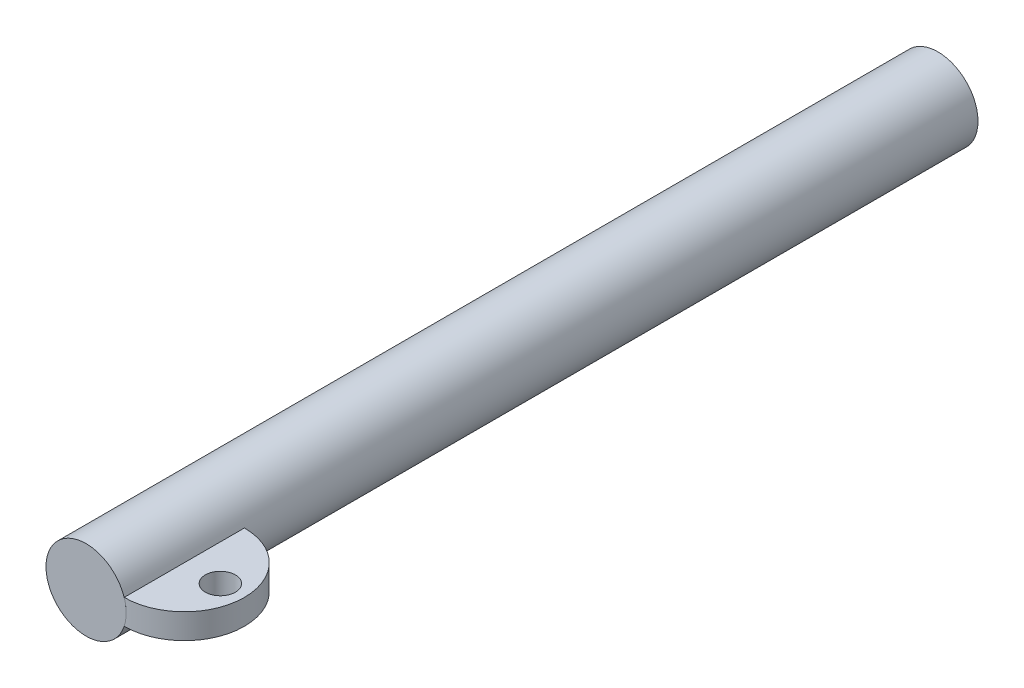
ISO-10303-21;
HEADER;
FILE_DESCRIPTION(('STEP AP214'),'2;1');
FILE_NAME('part.step','',(''),(''),'','','');
FILE_SCHEMA(('AUTOMOTIVE_DESIGN { 1 0 10303 214 1 1 1 1 }'));
ENDSEC;
DATA;
#1=APPLICATION_CONTEXT('core data for automotive mechanical design processes');
#2=APPLICATION_PROTOCOL_DEFINITION('international standard','automotive_design',2000,#1);
#3=PRODUCT_CONTEXT('',#1,'mechanical');
#4=PRODUCT('Part','Part','',(#3));
#5=PRODUCT_RELATED_PRODUCT_CATEGORY('part','',(#4));
#6=PRODUCT_DEFINITION_FORMATION('','',#4);
#7=PRODUCT_DEFINITION_CONTEXT('part definition',#1,'design');
#8=PRODUCT_DEFINITION('design','',#6,#7);
#9=PRODUCT_DEFINITION_SHAPE('','',#8);
#10=(LENGTH_UNIT() NAMED_UNIT(*) SI_UNIT(.MILLI.,.METRE.));
#11=(NAMED_UNIT(*) PLANE_ANGLE_UNIT() SI_UNIT($,.RADIAN.));
#12=(NAMED_UNIT(*) SI_UNIT($,.STERADIAN.) SOLID_ANGLE_UNIT());
#13=UNCERTAINTY_MEASURE_WITH_UNIT(LENGTH_MEASURE(1.E-05),#10,'distance_accuracy_value','');
#14=(GEOMETRIC_REPRESENTATION_CONTEXT(3) GLOBAL_UNCERTAINTY_ASSIGNED_CONTEXT((#13)) GLOBAL_UNIT_ASSIGNED_CONTEXT((#10,
#11,#12)) REPRESENTATION_CONTEXT('',''));
#15=CARTESIAN_POINT('',(0.,0.,0.));
#16=DIRECTION('',(0.,0.,1.));
#17=DIRECTION('',(1.,0.,0.));
#18=AXIS2_PLACEMENT_3D('',#15,#16,#17);
#19=CARTESIAN_POINT('',(0.,0.,-425.));
#20=DIRECTION('',(0.,0.,1.));
#21=DIRECTION('',(1.,0.,0.));
#22=AXIS2_PLACEMENT_3D('',#19,#20,#21);
#23=CYLINDRICAL_SURFACE('',#22,20.);
#24=CARTESIAN_POINT('',(0.,0.,-425.));
#25=DIRECTION('',(0.,0.,1.));
#26=DIRECTION('',(1.,0.,0.));
#27=AXIS2_PLACEMENT_3D('',#24,#25,#26);
#28=CIRCLE('',#27,20.);
#29=CARTESIAN_POINT('',(20.,0.,-425.));
#30=VERTEX_POINT('',#29);
#31=EDGE_CURVE('E11',#30,#30,#28,.T.);
#32=ORIENTED_EDGE('',*,*,#31,.T.);
#33=EDGE_LOOP('',(#32));
#34=FACE_BOUND('',#33,.T.);
#35=CARTESIAN_POINT('',(0.,0.,0.));
#36=DIRECTION('',(0.,0.,1.));
#37=DIRECTION('',(1.,0.,0.));
#38=AXIS2_PLACEMENT_3D('',#35,#36,#37);
#39=CIRCLE('',#38,20.);
#40=CARTESIAN_POINT('',(19.,6.2449979983984,0.));
#41=VERTEX_POINT('',#40);
#42=CARTESIAN_POINT('',(19.,-6.2449979983984,0.));
#43=VERTEX_POINT('',#42);
#44=EDGE_CURVE('E43',#41,#43,#39,.T.);
#45=ORIENTED_EDGE('',*,*,#44,.F.);
#46=DIRECTION('',(0.,0.,1.));
#47=VECTOR('',#46,1.);
#48=CARTESIAN_POINT('',(19.,6.2449979983984,-425.));
#49=LINE('',#48,#47);
#50=CARTESIAN_POINT('',(19.,6.2449979983984,-60.));
#51=VERTEX_POINT('',#50);
#52=EDGE_CURVE('E107',#41,#51,#49,.F.);
#53=ORIENTED_EDGE('',*,*,#52,.T.);
#54=CARTESIAN_POINT('',(19.,6.2449979983984,-60.));
#55=CARTESIAN_POINT('',(19.0889471250793,5.97438075779492,-59.9999952815088));
#56=CARTESIAN_POINT('',(19.172100959332,5.70189825528486,-59.9996051258468));
#57=CARTESIAN_POINT('',(19.3266974689682,5.15363119183452,-59.9983215060901));
#58=CARTESIAN_POINT('',(19.3981401067039,4.87784662028216,-59.9974280403774));
#59=CARTESIAN_POINT('',(19.5946856675783,4.04630312248677,-59.9943944650961));
#60=CARTESIAN_POINT('',(19.7020442006615,3.48623886908552,-59.9919009475934));
#61=CARTESIAN_POINT('',(19.866387338297,2.37374728895628,-59.9875957986327));
#62=CARTESIAN_POINT('',(19.9246098617598,1.82150037566649,-59.9857681142487));
#63=CARTESIAN_POINT('',(19.9949426873814,0.714110853455708,-59.9835183422667));
#64=CARTESIAN_POINT('',(20.0070592566365,0.158968648359584,-59.9830960636356));
#65=CARTESIAN_POINT('',(19.986382428263,-0.886108977931741,-59.9837799131172));
#66=CARTESIAN_POINT('',(19.9586269322716,-1.37615137907498,-59.9847147209149));
#67=CARTESIAN_POINT('',(19.8671764911383,-2.35284066708519,-59.987499194101));
#68=CARTESIAN_POINT('',(19.8034834685333,-2.83948773418136,-59.9893488105496));
#69=CARTESIAN_POINT('',(19.6385571556995,-3.818256813683,-59.9933197147569));
#70=CARTESIAN_POINT('',(19.5364729492486,-4.31023676867183,-59.995446386147));
#71=CARTESIAN_POINT('',(19.3558268777008,-5.04133448333337,-59.997949321022));
#72=CARTESIAN_POINT('',(19.2910131231902,-5.28392417311079,-59.998669176948));
#73=CARTESIAN_POINT('',(19.1522994875622,-5.76649281051237,-59.9996930834516));
#74=CARTESIAN_POINT('',(19.0783995991448,-6.00647175603886,-59.9999971336952));
#75=CARTESIAN_POINT('',(19.,-6.2449979983984,-60.));
#76=B_SPLINE_CURVE_WITH_KNOTS('',3,(#54,#55,#56,#57,#58,#59,#60,#61,#62,#63,#64,#65,#66,#67,#68,
#69,#70,#71,#72,#73,#74,#75),.UNSPECIFIED.,.F.,.F.,(4,2,2,2,2,2,2,2,2,2,4),(0.,
0.854441622397553,1.70888599151255,3.41741106804129,5.08148507700075,6.74533288340163,
8.21651476825947,9.68761795729187,11.1934579413176,11.9466035862561,12.6997498362889),.UNSPECIFIED.);
#77=CARTESIAN_POINT('',(19.,-6.2449979983984,-60.));
#78=VERTEX_POINT('',#77);
#79=EDGE_CURVE('E101',#51,#78,#76,.T.);
#80=ORIENTED_EDGE('',*,*,#79,.T.);
#81=DIRECTION('',(0.,0.,1.));
#82=VECTOR('',#81,1.);
#83=CARTESIAN_POINT('',(19.,-6.2449979983984,-425.));
#84=LINE('',#83,#82);
#85=EDGE_CURVE('E60',#78,#43,#84,.T.);
#86=ORIENTED_EDGE('',*,*,#85,.T.);
#87=EDGE_LOOP('',(#45,#53,#80,#86));
#88=FACE_BOUND('',#87,.T.);
#89=ADVANCED_FACE('F39',(#34,#88),#23,.T.);
#90=EDGE_CURVE('E157',#43,#41,#39,.T.);
#91=ORIENTED_EDGE('',*,*,#90,.F.);
#92=CARTESIAN_POINT('',(19.,-6.24499799839839,0.));
#93=CARTESIAN_POINT('',(19.0889471250793,-5.97438075779491,-4.71849120513157E-06));
#94=CARTESIAN_POINT('',(19.172100959332,-5.70189825528485,-0.00039487415320274));
#95=CARTESIAN_POINT('',(19.3266974689682,-5.15363119183452,-0.00167849390993508));
#96=CARTESIAN_POINT('',(19.3981401067039,-4.87784662028215,-0.00257195962261838));
#97=CARTESIAN_POINT('',(19.5946856675783,-4.04630312248676,-0.00560553490386928));
#98=CARTESIAN_POINT('',(19.7020442006615,-3.48623886908551,-0.00809905240661578));
#99=CARTESIAN_POINT('',(19.866387338297,-2.37374728895627,-0.0124042013672518));
#100=CARTESIAN_POINT('',(19.9246098617598,-1.82150037566648,-0.014231885751331));
#101=CARTESIAN_POINT('',(19.9949426873814,-0.714110853455702,-0.0164816577333006));
#102=CARTESIAN_POINT('',(20.0070592566365,-0.158968648359578,-0.0169039363643958));
#103=CARTESIAN_POINT('',(19.986382428263,0.886108977931745,-0.0162200868827476));
#104=CARTESIAN_POINT('',(19.9586269322716,1.37615137907499,-0.015285279085082));
#105=CARTESIAN_POINT('',(19.8671764911383,2.35284066708519,-0.012500805899001));
#106=CARTESIAN_POINT('',(19.8034834685333,2.83948773418136,-0.0106511894504271));
#107=CARTESIAN_POINT('',(19.6385571556995,3.81825681368299,-0.00668028524310137));
#108=CARTESIAN_POINT('',(19.5364729492486,4.31023676867182,-0.00455361385300047));
#109=CARTESIAN_POINT('',(19.3558268777008,5.04133448333336,-0.0020506789780109));
#110=CARTESIAN_POINT('',(19.2910131231902,5.28392417311078,-0.00133082305201313));
#111=CARTESIAN_POINT('',(19.1522994875622,5.76649281051236,-0.000306916548394861));
#112=CARTESIAN_POINT('',(19.0783995991448,6.00647175603885,-2.86630484225763E-06));
#113=CARTESIAN_POINT('',(19.,6.24499799839839,0.));
#114=B_SPLINE_CURVE_WITH_KNOTS('',3,(#92,#93,#94,#95,#96,#97,#98,#99,#100,#101,#102,#103,#104,
#105,#106,#107,#108,#109,#110,#111,#112,#113),.UNSPECIFIED.,.F.,.F.,(4,2,2,2,2,2,2,2,2,2,4),(0.,
0.854441622397552,1.70888599151255,3.41741106804129,5.08148507700075,6.74533288340163,
8.21651476825947,9.68761795729186,11.1934579413176,11.9466035862561,12.6997498362889),.UNSPECIFIED.);
#115=EDGE_CURVE('E121',#43,#41,#114,.T.);
#116=ORIENTED_EDGE('',*,*,#115,.T.);
#117=EDGE_LOOP('',(#91,#116));
#118=FACE_BOUND('',#117,.T.);
#119=ADVANCED_FACE('F137',(#118),#23,.T.);
#120=CARTESIAN_POINT('',(0.,0.,-425.));
#121=DIRECTION('',(0.,0.,1.));
#122=DIRECTION('',(1.,0.,0.));
#123=AXIS2_PLACEMENT_3D('',#120,#121,#122);
#124=PLANE('',#123);
#125=ORIENTED_EDGE('',*,*,#31,.F.);
#126=EDGE_LOOP('',(#125));
#127=FACE_BOUND('',#126,.T.);
#128=ADVANCED_FACE('F133',(#127),#124,.F.);
#129=CARTESIAN_POINT('',(0.,0.,0.));
#130=DIRECTION('',(0.,0.,1.));
#131=DIRECTION('',(1.,0.,0.));
#132=AXIS2_PLACEMENT_3D('',#129,#130,#131);
#133=PLANE('',#132);
#134=ORIENTED_EDGE('',*,*,#90,.T.);
#135=ORIENTED_EDGE('',*,*,#44,.T.);
#136=EDGE_LOOP('',(#134,#135));
#137=FACE_BOUND('',#136,.T.);
#138=ADVANCED_FACE('F136',(#137),#133,.T.);
#139=CARTESIAN_POINT('',(19.,6.25,-60.));
#140=DIRECTION('',(1.,0.,0.));
#141=DIRECTION('',(0.,0.,-1.));
#142=AXIS2_PLACEMENT_3D('',#139,#140,#141);
#143=PLANE('',#142);
#144=ORIENTED_EDGE('',*,*,#52,.F.);
#145=DIRECTION('',(0.,-1.,0.));
#146=VECTOR('',#145,1.);
#147=CARTESIAN_POINT('',(19.,6.25,0.));
#148=LINE('',#147,#146);
#149=CARTESIAN_POINT('',(19.,6.25,0.));
#150=VERTEX_POINT('',#149);
#151=EDGE_CURVE('E87',#150,#41,#148,.T.);
#152=ORIENTED_EDGE('',*,*,#151,.F.);
#153=DIRECTION('',(0.,0.,1.));
#154=VECTOR('',#153,1.);
#155=CARTESIAN_POINT('',(19.,6.25,-60.));
#156=LINE('',#155,#154);
#157=CARTESIAN_POINT('',(19.,6.25,-60.));
#158=VERTEX_POINT('',#157);
#159=EDGE_CURVE('E80',#158,#150,#156,.T.);
#160=ORIENTED_EDGE('',*,*,#159,.F.);
#161=DIRECTION('',(0.,-1.,0.));
#162=VECTOR('',#161,1.);
#163=CARTESIAN_POINT('',(19.,6.25,-60.));
#164=LINE('',#163,#162);
#165=EDGE_CURVE('E84',#158,#51,#164,.T.);
#166=ORIENTED_EDGE('',*,*,#165,.T.);
#167=EDGE_LOOP('',(#144,#152,#160,#166));
#168=FACE_BOUND('',#167,.T.);
#169=ADVANCED_FACE('F82',(#168),#143,.F.);
#170=CARTESIAN_POINT('',(19.,6.25,-30.));
#171=DIRECTION('',(0.,1.,0.));
#172=DIRECTION('',(0.,0.,1.));
#173=AXIS2_PLACEMENT_3D('',#170,#171,#172);
#174=PLANE('',#173);
#175=CARTESIAN_POINT('',(19.,6.25,-30.));
#176=DIRECTION('',(0.,1.,0.));
#177=DIRECTION('',(0.,0.,1.));
#178=AXIS2_PLACEMENT_3D('',#175,#176,#177);
#179=CIRCLE('',#178,30.);
#180=EDGE_CURVE('E91',#150,#158,#179,.T.);
#181=ORIENTED_EDGE('',*,*,#180,.T.);
#182=ORIENTED_EDGE('',*,*,#159,.T.);
#183=EDGE_LOOP('',(#181,#182));
#184=FACE_BOUND('',#183,.T.);
#185=CARTESIAN_POINT('',(37.,6.25,-30.));
#186=DIRECTION('',(0.,1.,0.));
#187=DIRECTION('',(0.,0.,1.));
#188=AXIS2_PLACEMENT_3D('',#185,#186,#187);
#189=CIRCLE('',#188,7.5);
#190=CARTESIAN_POINT('',(37.,6.25,-22.5));
#191=VERTEX_POINT('',#190);
#192=EDGE_CURVE('E168',#191,#191,#189,.T.);
#193=ORIENTED_EDGE('',*,*,#192,.F.);
#194=EDGE_LOOP('',(#193));
#195=FACE_BOUND('',#194,.T.);
#196=ADVANCED_FACE('F93',(#184,#195),#174,.T.);
#197=CARTESIAN_POINT('',(19.,-6.25,-30.));
#198=DIRECTION('',(0.,1.,0.));
#199=DIRECTION('',(0.,0.,1.));
#200=AXIS2_PLACEMENT_3D('',#197,#198,#199);
#201=PLANE('',#200);
#202=CARTESIAN_POINT('',(19.,-6.25,-30.));
#203=DIRECTION('',(0.,1.,0.));
#204=DIRECTION('',(0.,0.,1.));
#205=AXIS2_PLACEMENT_3D('',#202,#203,#204);
#206=CIRCLE('',#205,30.);
#207=CARTESIAN_POINT('',(19.,-6.25,0.));
#208=VERTEX_POINT('',#207);
#209=CARTESIAN_POINT('',(19.,-6.25,-60.));
#210=VERTEX_POINT('',#209);
#211=EDGE_CURVE('E166',#208,#210,#206,.T.);
#212=ORIENTED_EDGE('',*,*,#211,.F.);
#213=DIRECTION('',(0.,0.,1.));
#214=VECTOR('',#213,1.);
#215=CARTESIAN_POINT('',(19.,-6.25,-60.));
#216=LINE('',#215,#214);
#217=EDGE_CURVE('E97',#210,#208,#216,.T.);
#218=ORIENTED_EDGE('',*,*,#217,.F.);
#219=EDGE_LOOP('',(#212,#218));
#220=FACE_BOUND('',#219,.T.);
#221=CARTESIAN_POINT('',(37.,-6.25,-30.));
#222=DIRECTION('',(0.,1.,0.));
#223=DIRECTION('',(0.,0.,1.));
#224=AXIS2_PLACEMENT_3D('',#221,#222,#223);
#225=CIRCLE('',#224,7.5);
#226=CARTESIAN_POINT('',(37.,-6.25,-22.5));
#227=VERTEX_POINT('',#226);
#228=EDGE_CURVE('E172',#227,#227,#225,.T.);
#229=ORIENTED_EDGE('',*,*,#228,.T.);
#230=EDGE_LOOP('',(#229));
#231=FACE_BOUND('',#230,.T.);
#232=ADVANCED_FACE('F131',(#220,#231),#201,.F.);
#233=CARTESIAN_POINT('',(19.,6.25,-30.));
#234=DIRECTION('',(0.,-1.,0.));
#235=DIRECTION('',(0.,0.,-1.));
#236=AXIS2_PLACEMENT_3D('',#233,#234,#235);
#237=CYLINDRICAL_SURFACE('',#236,30.);
#238=ORIENTED_EDGE('',*,*,#115,.F.);
#239=EDGE_CURVE('E55',#43,#208,#148,.T.);
#240=ORIENTED_EDGE('',*,*,#239,.T.);
#241=ORIENTED_EDGE('',*,*,#211,.T.);
#242=EDGE_CURVE('E103',#78,#210,#164,.T.);
#243=ORIENTED_EDGE('',*,*,#242,.F.);
#244=ORIENTED_EDGE('',*,*,#79,.F.);
#245=ORIENTED_EDGE('',*,*,#165,.F.);
#246=ORIENTED_EDGE('',*,*,#180,.F.);
#247=ORIENTED_EDGE('',*,*,#151,.T.);
#248=EDGE_LOOP('',(#238,#240,#241,#243,#244,#245,#246,#247));
#249=FACE_BOUND('',#248,.T.);
#250=ADVANCED_FACE('F99',(#249),#237,.T.);
#251=ORIENTED_EDGE('',*,*,#85,.F.);
#252=ORIENTED_EDGE('',*,*,#242,.T.);
#253=ORIENTED_EDGE('',*,*,#217,.T.);
#254=ORIENTED_EDGE('',*,*,#239,.F.);
#255=EDGE_LOOP('',(#251,#252,#253,#254));
#256=FACE_BOUND('',#255,.T.);
#257=ADVANCED_FACE('F130',(#256),#143,.F.);
#258=CARTESIAN_POINT('',(37.,6.25,-30.));
#259=DIRECTION('',(0.,-1.,0.));
#260=DIRECTION('',(0.,0.,-1.));
#261=AXIS2_PLACEMENT_3D('',#258,#259,#260);
#262=CYLINDRICAL_SURFACE('',#261,7.5);
#263=ORIENTED_EDGE('',*,*,#192,.T.);
#264=EDGE_LOOP('',(#263));
#265=FACE_BOUND('',#264,.T.);
#266=ORIENTED_EDGE('',*,*,#228,.F.);
#267=EDGE_LOOP('',(#266));
#268=FACE_BOUND('',#267,.T.);
#269=ADVANCED_FACE('F179',(#265,#268),#262,.F.);
#270=CLOSED_SHELL('',(#89,#119,#128,#138,#169,#196,#232,#250,#257,#269));
#271=MANIFOLD_SOLID_BREP('B2',#270);
#272=ADVANCED_BREP_SHAPE_REPRESENTATION('',(#18,#271),#14);
#273=SHAPE_DEFINITION_REPRESENTATION(#9,#272);
ENDSEC;
END-ISO-10303-21;
